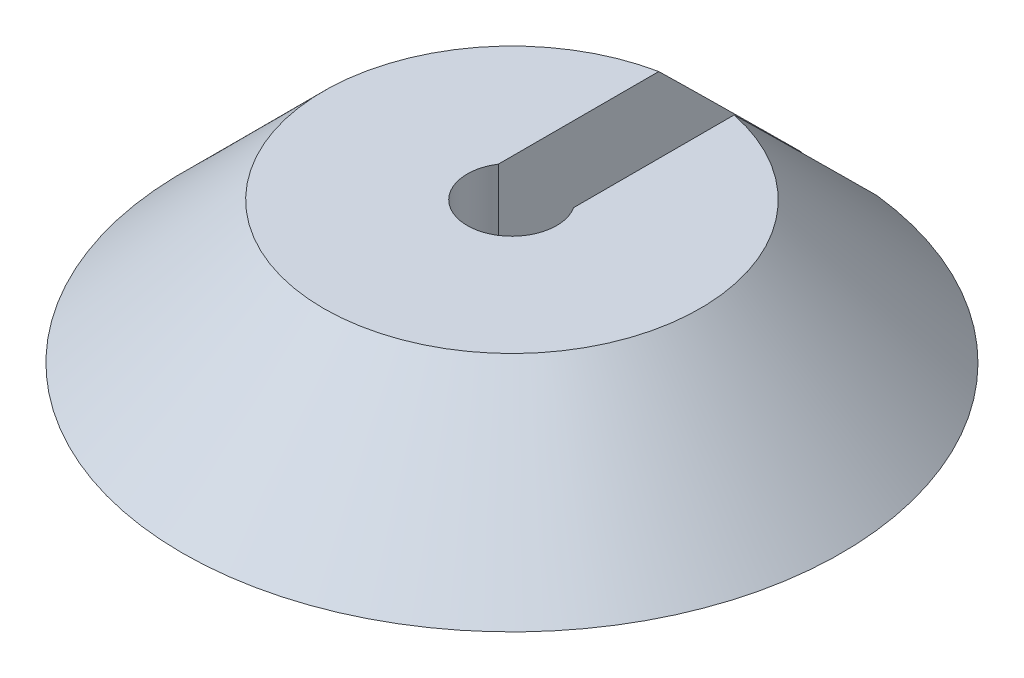
ISO-10303-21;
HEADER;
FILE_DESCRIPTION(('STEP AP214'),'2;1');
FILE_NAME('part.step','',(''),(''),'','','');
FILE_SCHEMA(('AUTOMOTIVE_DESIGN { 1 0 10303 214 1 1 1 1 }'));
ENDSEC;
DATA;
#1=APPLICATION_CONTEXT('core data for automotive mechanical design processes');
#2=APPLICATION_PROTOCOL_DEFINITION('international standard','automotive_design',2000,#1);
#3=PRODUCT_CONTEXT('',#1,'mechanical');
#4=PRODUCT('Part','Part','',(#3));
#5=PRODUCT_RELATED_PRODUCT_CATEGORY('part','',(#4));
#6=PRODUCT_DEFINITION_FORMATION('','',#4);
#7=PRODUCT_DEFINITION_CONTEXT('part definition',#1,'design');
#8=PRODUCT_DEFINITION('design','',#6,#7);
#9=PRODUCT_DEFINITION_SHAPE('','',#8);
#10=(LENGTH_UNIT() NAMED_UNIT(*) SI_UNIT(.MILLI.,.METRE.));
#11=(NAMED_UNIT(*) PLANE_ANGLE_UNIT() SI_UNIT($,.RADIAN.));
#12=(NAMED_UNIT(*) SI_UNIT($,.STERADIAN.) SOLID_ANGLE_UNIT());
#13=UNCERTAINTY_MEASURE_WITH_UNIT(LENGTH_MEASURE(1.E-05),#10,'distance_accuracy_value','');
#14=(GEOMETRIC_REPRESENTATION_CONTEXT(3) GLOBAL_UNCERTAINTY_ASSIGNED_CONTEXT((#13)) GLOBAL_UNIT_ASSIGNED_CONTEXT((#10,
#11,#12)) REPRESENTATION_CONTEXT('',''));
#15=CARTESIAN_POINT('',(0.,0.,0.));
#16=DIRECTION('',(0.,0.,1.));
#17=DIRECTION('',(1.,0.,0.));
#18=AXIS2_PLACEMENT_3D('',#15,#16,#17);
#19=CARTESIAN_POINT('',(0.,0.,0.));
#20=DIRECTION('',(0.,-1.,0.));
#21=DIRECTION('',(1.,0.,0.));
#22=AXIS2_PLACEMENT_3D('',#19,#20,#21);
#23=PLANE('',#22);
#24=CARTESIAN_POINT('',(0.,0.,0.));
#25=DIRECTION('',(0.,-1.,0.));
#26=DIRECTION('',(1.,0.,0.));
#27=AXIS2_PLACEMENT_3D('',#24,#25,#26);
#28=CIRCLE('',#27,7.);
#29=CARTESIAN_POINT('',(0.800000000000003,0.,-6.95413546028548));
#30=VERTEX_POINT('',#29);
#31=CARTESIAN_POINT('',(-0.8,0.,-6.95413546028548));
#32=VERTEX_POINT('',#31);
#33=EDGE_CURVE('E11',#30,#32,#28,.T.);
#34=ORIENTED_EDGE('',*,*,#33,.T.);
#35=DIRECTION('',(0.,0.,1.));
#36=VECTOR('',#35,1.);
#37=CARTESIAN_POINT('',(-0.8,0.,-0.512347538297982));
#38=LINE('',#37,#36);
#39=CARTESIAN_POINT('',(-0.8,0.,-0.512347538297982));
#40=VERTEX_POINT('',#39);
#41=EDGE_CURVE('E87',#32,#40,#38,.T.);
#42=ORIENTED_EDGE('',*,*,#41,.T.);
#43=CARTESIAN_POINT('',(0.,0.,0.));
#44=DIRECTION('',(0.,1.,0.));
#45=DIRECTION('',(-1.,0.,0.));
#46=AXIS2_PLACEMENT_3D('',#43,#44,#45);
#47=CIRCLE('',#46,0.95);
#48=CARTESIAN_POINT('',(0.8,0.,-0.512347538297983));
#49=VERTEX_POINT('',#48);
#50=EDGE_CURVE('E94',#40,#49,#47,.T.);
#51=ORIENTED_EDGE('',*,*,#50,.T.);
#52=DIRECTION('',(0.,0.,-1.));
#53=VECTOR('',#52,1.);
#54=CARTESIAN_POINT('',(0.8,0.,-0.512347538297983));
#55=LINE('',#54,#53);
#56=EDGE_CURVE('E77',#49,#30,#55,.T.);
#57=ORIENTED_EDGE('',*,*,#56,.T.);
#58=EDGE_LOOP('',(#34,#42,#51,#57));
#59=FACE_BOUND('',#58,.T.);
#60=ADVANCED_FACE('F39',(#59),#23,.T.);
#61=CARTESIAN_POINT('',(0.,0.,0.));
#62=DIRECTION('',(0.,1.,0.));
#63=DIRECTION('',(-1.,0.,0.));
#64=AXIS2_PLACEMENT_3D('',#61,#62,#63);
#65=CYLINDRICAL_SURFACE('',#64,0.95);
#66=DIRECTION('',(0.,1.,0.));
#67=VECTOR('',#66,1.);
#68=CARTESIAN_POINT('',(0.8,0.,-0.512347538297983));
#69=LINE('',#68,#67);
#70=CARTESIAN_POINT('',(0.800002005633061,3.00000600000001,-0.513153994975452));
#71=VERTEX_POINT('',#70);
#72=EDGE_CURVE('E63',#49,#71,#69,.T.);
#73=ORIENTED_EDGE('',*,*,#72,.F.);
#74=ORIENTED_EDGE('',*,*,#50,.F.);
#75=DIRECTION('',(0.,1.,0.));
#76=VECTOR('',#75,1.);
#77=CARTESIAN_POINT('',(-0.8,0.,-0.512347538297982));
#78=LINE('',#77,#76);
#79=CARTESIAN_POINT('',(-0.800002329249019,3.00000600000001,-0.513245633185011));
#80=VERTEX_POINT('',#79);
#81=EDGE_CURVE('E96',#40,#80,#78,.T.);
#82=ORIENTED_EDGE('',*,*,#81,.T.);
#83=CARTESIAN_POINT('',(0.,3.000012,0.));
#84=DIRECTION('',(0.,1.,0.));
#85=DIRECTION('',(-0.84125158480702,0.,-0.540643848628353));
#86=AXIS2_PLACEMENT_3D('',#83,#84,#85);
#87=CIRCLE('',#86,0.95);
#88=EDGE_CURVE('E92',#80,#71,#87,.T.);
#89=ORIENTED_EDGE('',*,*,#88,.T.);
#90=EDGE_LOOP('',(#73,#74,#82,#89));
#91=FACE_BOUND('',#90,.T.);
#92=ADVANCED_FACE('F95',(#91),#65,.F.);
#93=CARTESIAN_POINT('',(0.,0.,0.));
#94=DIRECTION('',(0.,-1.,0.));
#95=DIRECTION('',(1.,0.,0.));
#96=AXIS2_PLACEMENT_3D('',#93,#94,#95);
#97=CONICAL_SURFACE('',#96,7.,0.785398163397428);
#98=CARTESIAN_POINT('',(-0.8,-0.000699999999976027,-6.95484007652222));
#99=CARTESIAN_POINT('',(-0.800000000000001,0.22775790042553,-6.7248657499669));
#100=CARTESIAN_POINT('',(-0.800000000000002,0.456150863998472,-6.49482681171146));
#101=CARTESIAN_POINT('',(-0.800000000000003,0.912775233082295,-6.03449990463052));
#102=CARTESIAN_POINT('',(-0.800000000000004,1.14100659853726,-5.80421189607564));
#103=CARTESIAN_POINT('',(-0.800000000000006,1.59813522658185,-5.34239865829702));
#104=CARTESIAN_POINT('',(-0.800000000000007,1.82703131394467,-5.11087226512952));
#105=CARTESIAN_POINT('',(-0.800000000000008,2.28435336003842,-4.64744280875017));
#106=CARTESIAN_POINT('',(-0.800000000000009,2.5127794001172,-4.41553982581154));
#107=CARTESIAN_POINT('',(-0.800000000000011,2.99266453686387,-3.92697267982855));
#108=CARTESIAN_POINT('',(-0.800000000000012,3.2440520880274,-3.67023809511463));
#109=CARTESIAN_POINT('',(-0.800000000000013,3.62010512428007,-3.28398093486901));
#110=CARTESIAN_POINT('',(-0.800000000000013,3.7453229282086,-3.1549963396332));
#111=CARTESIAN_POINT('',(-0.800000000000014,3.9952174604583,-2.89651872892204));
#112=CARTESIAN_POINT('',(-0.800000000000014,4.11989422168172,-2.76702574530187));
#113=CARTESIAN_POINT('',(-0.800000000000015,4.36810932711496,-2.50764058473694));
#114=CARTESIAN_POINT('',(-0.800000000000016,4.49164987079808,-2.37775051387047));
#115=CARTESIAN_POINT('',(-0.800000000000017,4.73752831291365,-2.11677291193255));
#116=CARTESIAN_POINT('',(-0.800000000000017,4.85986592016117,-1.98568510506246));
#117=CARTESIAN_POINT('',(-0.800000000000018,5.04168997068431,-1.78763720798304));
#118=CARTESIAN_POINT('',(-0.800000000000018,5.10198576018596,-1.72142104271151));
#119=CARTESIAN_POINT('',(-0.800000000000018,5.2218274472652,-1.58831449561782));
#120=CARTESIAN_POINT('',(-0.800000000000018,5.28137336406486,-1.5214241311574));
#121=CARTESIAN_POINT('',(-0.800000000000019,5.39938012683941,-1.38673635066776));
#122=CARTESIAN_POINT('',(-0.800000000000019,5.45784137726882,-1.318939289646));
#123=CARTESIAN_POINT('',(-0.80000000000002,5.57318655017494,-1.18201955996618));
#124=CARTESIAN_POINT('',(-0.80000000000002,5.63007070998366,-1.11289709344228));
#125=CARTESIAN_POINT('',(-0.80000000000002,5.70140101773158,-1.0229864240142));
#126=CARTESIAN_POINT('',(-0.80000000000002,5.71700293746174,-1.00311497799959));
#127=CARTESIAN_POINT('',(-0.80000000000002,5.74797214082167,-0.963189005346304));
#128=CARTESIAN_POINT('',(-0.80000000000002,5.76333941589398,-0.943134472072881));
#129=CARTESIAN_POINT('',(-0.80000000000002,5.80904072761092,-0.882657047691452));
#130=CARTESIAN_POINT('',(-0.80000000000002,5.83896987595819,-0.841925809175273));
#131=CARTESIAN_POINT('',(-0.800000000000021,5.89737444954142,-0.759366487044721));
#132=CARTESIAN_POINT('',(-0.800000000000021,5.92584844136763,-0.717537381088652));
#133=CARTESIAN_POINT('',(-0.800000000000021,5.98067457603818,-0.632516646799169));
#134=CARTESIAN_POINT('',(-0.800000000000021,6.00702737848078,-0.589325447877625));
#135=CARTESIAN_POINT('',(-0.800000000000021,6.06304690812015,-0.489891148789397));
#136=CARTESIAN_POINT('',(-0.800000000000021,6.09183282238334,-0.433139228949016));
#137=CARTESIAN_POINT('',(-0.800000000000021,6.14126665662244,-0.316486069323486));
#138=CARTESIAN_POINT('',(-0.800000000000021,6.16197805183296,-0.256613769148271));
#139=CARTESIAN_POINT('',(-0.800000000000021,6.18407885390286,-0.163340653300858));
#140=CARTESIAN_POINT('',(-0.800000000000022,6.18997102407071,-0.131021736327068));
#141=CARTESIAN_POINT('',(-0.800000000000022,6.19799431739435,-0.065590425694156));
#142=CARTESIAN_POINT('',(-0.800000000000022,6.20008607126314,-0.032473287761433));
#143=CARTESIAN_POINT('',(-0.800000000000022,6.19999969375031,0.000700000000000177));
#144=B_SPLINE_CURVE_WITH_KNOTS('',3,(#98,#99,#100,#101,#102,#103,#104,#105,#106,#107,#108,#109,
#110,#111,#112,#113,#114,#115,#116,#117,#118,#119,#120,#121,#122,#123,#124,#125,#126,#127,#128,
#129,#130,#131,#132,#133,#134,#135,#136,#137,#138,#139,#140,#141,#142,#143),.UNSPECIFIED.,.F.,
.F.,(4,2,2,2,2,2,2,2,2,2,2,2,2,2,2,2,2,2,2,2,2,2,4),(0.,0.972487017358135,1.94516315513459,
2.92188221403015,3.89841496547465,4.97636040851379,5.51566340982429,6.05493314169321,
6.59270585022688,7.13060567779779,7.39926805260565,7.66792352650302,7.93647672372679,
8.20498928531133,8.28078120424348,8.35657588072712,8.50818625736162,8.65994320844139,
8.8116527858807,9.00223160197171,9.19128048525166,9.28962473891859,9.38898207524534),.UNSPECIFIED.);
#145=CARTESIAN_POINT('',(-0.800000000000011,3.00000000000011,-3.9191835884531));
#146=VERTEX_POINT('',#145);
#147=EDGE_CURVE('E57',#32,#146,#144,.T.);
#148=ORIENTED_EDGE('',*,*,#147,.F.);
#149=ORIENTED_EDGE('',*,*,#33,.F.);
#150=CARTESIAN_POINT('',(0.799999999999979,6.19999969375032,0.0007));
#151=CARTESIAN_POINT('',(0.799999999999979,6.20004208690325,-0.023945955581609));
#152=CARTESIAN_POINT('',(0.799999999999979,6.19890439237235,-0.0485802000043416));
#153=CARTESIAN_POINT('',(0.799999999999979,6.19443200187597,-0.0975977156568485));
#154=CARTESIAN_POINT('',(0.799999999999979,6.19110198380093,-0.121981409239601));
#155=CARTESIAN_POINT('',(0.799999999999979,6.18250062273088,-0.169855203301793));
#156=CARTESIAN_POINT('',(0.799999999999979,6.17727265634521,-0.193353237272587));
#157=CARTESIAN_POINT('',(0.799999999999979,6.1651040578166,-0.239907605545868));
#158=CARTESIAN_POINT('',(0.799999999999979,6.15816254451971,-0.262963705999487));
#159=CARTESIAN_POINT('',(0.799999999999979,6.13369857877396,-0.335697071674125));
#160=CARTESIAN_POINT('',(0.799999999999979,6.11340629391115,-0.384443713822927));
#161=CARTESIAN_POINT('',(0.799999999999979,6.06814033916392,-0.479716382791849));
#162=CARTESIAN_POINT('',(0.799999999999979,6.04315815432054,-0.526238174315808));
#163=CARTESIAN_POINT('',(0.799999999999979,5.98960819306796,-0.618317895924853));
#164=CARTESIAN_POINT('',(0.799999999999979,5.96098192532653,-0.663841352983012));
#165=CARTESIAN_POINT('',(0.799999999999979,5.90159737165339,-0.753397958716347));
#166=CARTESIAN_POINT('',(0.79999999999998,5.87084096395127,-0.797432370606766));
#167=CARTESIAN_POINT('',(0.79999999999998,5.80505277443355,-0.888235720450542));
#168=CARTESIAN_POINT('',(0.79999999999998,5.76988299683358,-0.934904032097096));
#169=CARTESIAN_POINT('',(0.79999999999998,5.69829139245948,-1.02727356497586));
#170=CARTESIAN_POINT('',(0.79999999999998,5.66186939607873,-1.07297465383759));
#171=CARTESIAN_POINT('',(0.799999999999981,5.55123003704465,-1.20902941115935));
#172=CARTESIAN_POINT('',(0.799999999999981,5.47567269153419,-1.29829003967999));
#173=CARTESIAN_POINT('',(0.799999999999982,5.32241147673558,-1.47520322292774));
#174=CARTESIAN_POINT('',(0.799999999999982,5.24470404401177,-1.5628526508982));
#175=CARTESIAN_POINT('',(0.799999999999982,5.08802991960989,-1.73697161470379));
#176=CARTESIAN_POINT('',(0.799999999999983,5.00906359304914,-1.82344147961669));
#177=CARTESIAN_POINT('',(0.799999999999983,4.8509564870828,-1.99486100991196));
#178=CARTESIAN_POINT('',(0.799999999999983,4.77182292037133,-2.07981735033128));
#179=CARTESIAN_POINT('',(0.799999999999984,4.61295967065653,-2.24918157916684));
#180=CARTESIAN_POINT('',(0.799999999999984,4.5332299455534,-2.33358942804753));
#181=CARTESIAN_POINT('',(0.799999999999985,4.29357090703204,-2.58603624585929));
#182=CARTESIAN_POINT('',(0.799999999999986,4.13300865520477,-2.75347375656115));
#183=CARTESIAN_POINT('',(0.799999999999987,3.80883314327369,-3.08958025955319));
#184=CARTESIAN_POINT('',(0.799999999999987,3.64520731084965,-3.25823708750121));
#185=CARTESIAN_POINT('',(0.799999999999988,3.3173220407736,-3.59493685796545));
#186=CARTESIAN_POINT('',(0.799999999999989,3.15306259650132,-3.76297979403153));
#187=CARTESIAN_POINT('',(0.79999999999999,2.65952906557632,-4.26664307231657));
#188=CARTESIAN_POINT('',(0.799999999999992,2.32963654327473,-4.60165693727255));
#189=CARTESIAN_POINT('',(0.799999999999994,1.6665405234929,-5.27338595126963));
#190=CARTESIAN_POINT('',(0.799999999999995,1.33333079029253,-5.61009493412835));
#191=CARTESIAN_POINT('',(0.799999999999997,0.833217912222561,-6.11471152551396));
#192=CARTESIAN_POINT('',(0.799999999999997,0.666501765772527,-6.28280448828406));
#193=CARTESIAN_POINT('',(0.799999999999998,0.332969679673111,-6.61889085371715));
#194=CARTESIAN_POINT('',(0.799999999999999,0.166153740182764,-6.78688425653796));
#195=CARTESIAN_POINT('',(0.8,-0.000699999999977108,-6.95484007652223));
#196=B_SPLINE_CURVE_WITH_KNOTS('',3,(#150,#151,#152,#153,#154,#155,#156,#157,#158,#159,#160,
#161,#162,#163,#164,#165,#166,#167,#168,#169,#170,#171,#172,#173,#174,#175,#176,#177,#178,#179,
#180,#181,#182,#183,#184,#185,#186,#187,#188,#189,#190,#191,#192,#193,#194,#195),.UNSPECIFIED.,
.F.,.F.,(4,2,2,2,2,2,2,2,2,2,2,2,2,2,2,2,2,2,2,2,2,2,4),(0.,0.0738902984794668,
0.147623441646837,0.219767826960662,0.291949388508241,0.449924861684723,0.6081899779719,
0.769425211947603,0.930520045160302,1.10579963875014,1.28110306732264,1.63187675209611,
1.98327145603912,2.33456603493738,2.68286893427751,3.03119666702066,3.72713396739355,
4.43209089980563,5.13705521798701,6.54757302420663,7.96870412212395,8.67894745627909,
9.38918966154327),.UNSPECIFIED.);
#197=CARTESIAN_POINT('',(0.799999999999989,3.00000000000012,-3.9191835884531));
#198=VERTEX_POINT('',#197);
#199=EDGE_CURVE('E81',#198,#30,#196,.T.);
#200=ORIENTED_EDGE('',*,*,#199,.F.);
#201=CARTESIAN_POINT('',(0.,3.00000000000011,0.));
#202=DIRECTION('',(0.,-1.,0.));
#203=DIRECTION('',(1.,0.,0.));
#204=AXIS2_PLACEMENT_3D('',#201,#202,#203);
#205=CIRCLE('',#204,4.00000000000001);
#206=EDGE_CURVE('E48',#198,#146,#205,.T.);
#207=ORIENTED_EDGE('',*,*,#206,.T.);
#208=EDGE_LOOP('',(#148,#149,#200,#207));
#209=FACE_BOUND('',#208,.T.);
#210=ADVANCED_FACE('F125',(#209),#97,.T.);
#211=CARTESIAN_POINT('',(4.,3.00000000000001,0.));
#212=DIRECTION('',(0.,1.,0.));
#213=DIRECTION('',(-1.,0.,0.));
#214=AXIS2_PLACEMENT_3D('',#211,#212,#213);
#215=PLANE('',#214);
#216=DIRECTION('',(0.,0.,1.));
#217=VECTOR('',#216,1.);
#218=CARTESIAN_POINT('',(-0.800000000000011,2.99999999999999,0.));
#219=LINE('',#218,#217);
#220=EDGE_CURVE('E148',#146,#80,#219,.T.);
#221=ORIENTED_EDGE('',*,*,#220,.F.);
#222=ORIENTED_EDGE('',*,*,#206,.F.);
#223=DIRECTION('',(0.,0.,-1.));
#224=VECTOR('',#223,1.);
#225=CARTESIAN_POINT('',(0.799999999999989,3.,0.));
#226=LINE('',#225,#224);
#227=EDGE_CURVE('E150',#71,#198,#226,.T.);
#228=ORIENTED_EDGE('',*,*,#227,.F.);
#229=ORIENTED_EDGE('',*,*,#88,.F.);
#230=EDGE_LOOP('',(#221,#222,#228,#229));
#231=FACE_BOUND('',#230,.T.);
#232=ADVANCED_FACE('F122',(#231),#215,.T.);
#233=CARTESIAN_POINT('',(0.8,0.,-0.512347538297983));
#234=DIRECTION('',(1.,0.,0.));
#235=DIRECTION('',(0.,1.,0.));
#236=AXIS2_PLACEMENT_3D('',#233,#234,#235);
#237=PLANE('',#236);
#238=ORIENTED_EDGE('',*,*,#199,.T.);
#239=ORIENTED_EDGE('',*,*,#56,.F.);
#240=ORIENTED_EDGE('',*,*,#72,.T.);
#241=ORIENTED_EDGE('',*,*,#227,.T.);
#242=EDGE_LOOP('',(#238,#239,#240,#241));
#243=FACE_BOUND('',#242,.T.);
#244=ADVANCED_FACE('F83',(#243),#237,.F.);
#245=CARTESIAN_POINT('',(-0.8,0.,-0.512347538297982));
#246=DIRECTION('',(-1.,0.,0.));
#247=DIRECTION('',(0.,-1.,0.));
#248=AXIS2_PLACEMENT_3D('',#245,#246,#247);
#249=PLANE('',#248);
#250=ORIENTED_EDGE('',*,*,#147,.T.);
#251=ORIENTED_EDGE('',*,*,#220,.T.);
#252=ORIENTED_EDGE('',*,*,#81,.F.);
#253=ORIENTED_EDGE('',*,*,#41,.F.);
#254=EDGE_LOOP('',(#250,#251,#252,#253));
#255=FACE_BOUND('',#254,.T.);
#256=ADVANCED_FACE('F160',(#255),#249,.F.);
#257=CLOSED_SHELL('',(#60,#92,#210,#232,#244,#256));
#258=MANIFOLD_SOLID_BREP('B2',#257);
#259=ADVANCED_BREP_SHAPE_REPRESENTATION('',(#18,#258),#14);
#260=SHAPE_DEFINITION_REPRESENTATION(#9,#259);
ENDSEC;
END-ISO-10303-21;
